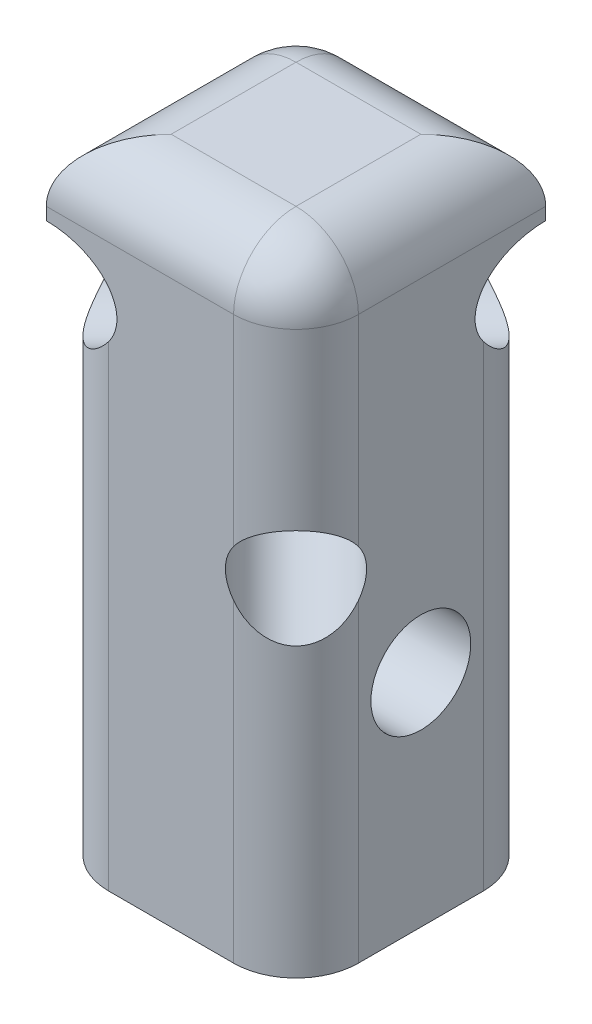
ISO-10303-21;
HEADER;
FILE_DESCRIPTION(('STEP AP214'),'2;1');
FILE_NAME('part.step','',(''),(''),'','','');
FILE_SCHEMA(('AUTOMOTIVE_DESIGN { 1 0 10303 214 1 1 1 1 }'));
ENDSEC;
DATA;
#1=APPLICATION_CONTEXT('core data for automotive mechanical design processes');
#2=APPLICATION_PROTOCOL_DEFINITION('international standard','automotive_design',2000,#1);
#3=PRODUCT_CONTEXT('',#1,'mechanical');
#4=PRODUCT('Part','Part','',(#3));
#5=PRODUCT_RELATED_PRODUCT_CATEGORY('part','',(#4));
#6=PRODUCT_DEFINITION_FORMATION('','',#4);
#7=PRODUCT_DEFINITION_CONTEXT('part definition',#1,'design');
#8=PRODUCT_DEFINITION('design','',#6,#7);
#9=PRODUCT_DEFINITION_SHAPE('','',#8);
#10=(LENGTH_UNIT() NAMED_UNIT(*) SI_UNIT(.MILLI.,.METRE.));
#11=(NAMED_UNIT(*) PLANE_ANGLE_UNIT() SI_UNIT($,.RADIAN.));
#12=(NAMED_UNIT(*) SI_UNIT($,.STERADIAN.) SOLID_ANGLE_UNIT());
#13=UNCERTAINTY_MEASURE_WITH_UNIT(LENGTH_MEASURE(1.E-05),#10,'distance_accuracy_value','');
#14=(GEOMETRIC_REPRESENTATION_CONTEXT(3) GLOBAL_UNCERTAINTY_ASSIGNED_CONTEXT((#13)) GLOBAL_UNIT_ASSIGNED_CONTEXT((#10,
#11,#12)) REPRESENTATION_CONTEXT('',''));
#15=CARTESIAN_POINT('',(0.,0.,0.));
#16=DIRECTION('',(0.,0.,1.));
#17=DIRECTION('',(1.,0.,0.));
#18=AXIS2_PLACEMENT_3D('',#15,#16,#17);
#19=CARTESIAN_POINT('',(3.,15.,3.));
#20=DIRECTION('',(-1.,0.,0.));
#21=DIRECTION('',(0.,0.,1.));
#22=AXIS2_PLACEMENT_3D('',#19,#20,#21);
#23=PLANE('',#22);
#24=CARTESIAN_POINT('',(3.,5.3,0.));
#25=DIRECTION('',(-1.,0.,0.));
#26=DIRECTION('',(0.,0.,1.));
#27=AXIS2_PLACEMENT_3D('',#24,#25,#26);
#28=CIRCLE('',#27,1.2);
#29=CARTESIAN_POINT('',(3.,5.3,1.2));
#30=VERTEX_POINT('',#29);
#31=EDGE_CURVE('E346',#30,#30,#28,.T.);
#32=ORIENTED_EDGE('',*,*,#31,.T.);
#33=EDGE_LOOP('',(#32));
#34=FACE_BOUND('',#33,.T.);
#35=DIRECTION('',(0.,-1.,0.));
#36=VECTOR('',#35,1.);
#37=CARTESIAN_POINT('',(3.,15.,-3.));
#38=LINE('',#37,#36);
#39=CARTESIAN_POINT('',(3.,13.5,-3.));
#40=VERTEX_POINT('',#39);
#41=CARTESIAN_POINT('',(3.,13.2,-3.));
#42=VERTEX_POINT('',#41);
#43=EDGE_CURVE('E172',#40,#42,#38,.T.);
#44=ORIENTED_EDGE('',*,*,#43,.F.);
#45=DIRECTION('',(0.,0.,-1.));
#46=VECTOR('',#45,1.);
#47=CARTESIAN_POINT('',(3.,13.5,3.));
#48=LINE('',#47,#46);
#49=CARTESIAN_POINT('',(3.,13.5,1.5));
#50=VERTEX_POINT('',#49);
#51=EDGE_CURVE('E52',#40,#50,#48,.F.);
#52=ORIENTED_EDGE('',*,*,#51,.T.);
#53=DIRECTION('',(0.,-1.,0.));
#54=VECTOR('',#53,1.);
#55=CARTESIAN_POINT('',(3.,15.,1.5));
#56=LINE('',#55,#54);
#57=CARTESIAN_POINT('',(3.,8.67124860801609,1.5));
#58=VERTEX_POINT('',#57);
#59=EDGE_CURVE('E221',#50,#58,#56,.T.);
#60=ORIENTED_EDGE('',*,*,#59,.T.);
#61=CARTESIAN_POINT('',(3.,8.11,3.));
#62=DIRECTION('',(-1.,0.,0.));
#63=DIRECTION('',(0.,0.,1.));
#64=AXIS2_PLACEMENT_3D('',#61,#62,#63);
#65=ELLIPSE('',#64,1.69705627484771,1.2);
#66=CARTESIAN_POINT('',(3.,7.54875139198391,1.5));
#67=VERTEX_POINT('',#66);
#68=EDGE_CURVE('E357',#58,#67,#65,.T.);
#69=ORIENTED_EDGE('',*,*,#68,.T.);
#70=DIRECTION('',(0.,-1.,0.));
#71=VECTOR('',#70,1.);
#72=CARTESIAN_POINT('',(3.,15.,1.5));
#73=LINE('',#72,#71);
#74=CARTESIAN_POINT('',(3.,0.,1.5));
#75=VERTEX_POINT('',#74);
#76=EDGE_CURVE('E218',#67,#75,#73,.T.);
#77=ORIENTED_EDGE('',*,*,#76,.T.);
#78=DIRECTION('',(0.,0.,-1.));
#79=VECTOR('',#78,1.);
#80=CARTESIAN_POINT('',(3.,0.,3.));
#81=LINE('',#80,#79);
#82=CARTESIAN_POINT('',(3.,0.,-1.5));
#83=VERTEX_POINT('',#82);
#84=EDGE_CURVE('E344',#75,#83,#81,.T.);
#85=ORIENTED_EDGE('',*,*,#84,.T.);
#86=DIRECTION('',(0.,-1.,0.));
#87=VECTOR('',#86,1.);
#88=CARTESIAN_POINT('',(3.,15.,-1.5));
#89=LINE('',#88,#87);
#90=CARTESIAN_POINT('',(3.,11.4387513919839,-1.5));
#91=VERTEX_POINT('',#90);
#92=EDGE_CURVE('E216',#83,#91,#89,.F.);
#93=ORIENTED_EDGE('',*,*,#92,.T.);
#94=CARTESIAN_POINT('',(3.,12.,-3.));
#95=DIRECTION('',(-1.,0.,0.));
#96=DIRECTION('',(0.,0.,1.));
#97=AXIS2_PLACEMENT_3D('',#94,#95,#96);
#98=ELLIPSE('',#97,1.69705627484771,1.2);
#99=EDGE_CURVE('E335',#91,#42,#98,.T.);
#100=ORIENTED_EDGE('',*,*,#99,.T.);
#101=EDGE_LOOP('',(#44,#52,#60,#69,#77,#85,#93,#100));
#102=FACE_BOUND('',#101,.T.);
#103=ADVANCED_FACE('F34',(#34,#102),#23,.F.);
#104=CARTESIAN_POINT('',(-3.,15.,-3.));
#105=DIRECTION('',(0.,0.,1.));
#106=DIRECTION('',(1.,0.,0.));
#107=AXIS2_PLACEMENT_3D('',#104,#105,#106);
#108=PLANE('',#107);
#109=CARTESIAN_POINT('',(3.,12.,-3.));
#110=DIRECTION('',(0.,0.,1.));
#111=DIRECTION('',(-1.,0.,0.));
#112=AXIS2_PLACEMENT_3D('',#109,#110,#111);
#113=ELLIPSE('',#112,1.69705627484771,1.2);
#114=CARTESIAN_POINT('',(1.5,11.4387513919839,-3.));
#115=VERTEX_POINT('',#114);
#116=EDGE_CURVE('E161',#42,#115,#113,.T.);
#117=ORIENTED_EDGE('',*,*,#116,.T.);
#118=DIRECTION('',(0.,-1.,0.));
#119=VECTOR('',#118,1.);
#120=CARTESIAN_POINT('',(1.5,15.,-3.));
#121=LINE('',#120,#119);
#122=CARTESIAN_POINT('',(1.5,0.,-3.));
#123=VERTEX_POINT('',#122);
#124=EDGE_CURVE('E213',#115,#123,#121,.T.);
#125=ORIENTED_EDGE('',*,*,#124,.T.);
#126=DIRECTION('',(-1.,0.,0.));
#127=VECTOR('',#126,1.);
#128=CARTESIAN_POINT('',(-3.,0.,-3.));
#129=LINE('',#128,#127);
#130=CARTESIAN_POINT('',(-1.5,0.,-3.));
#131=VERTEX_POINT('',#130);
#132=EDGE_CURVE('E341',#123,#131,#129,.T.);
#133=ORIENTED_EDGE('',*,*,#132,.T.);
#134=DIRECTION('',(0.,-1.,0.));
#135=VECTOR('',#134,1.);
#136=CARTESIAN_POINT('',(-1.5,15.,-3.));
#137=LINE('',#136,#135);
#138=CARTESIAN_POINT('',(-1.5,7.54875139198391,-3.));
#139=VERTEX_POINT('',#138);
#140=EDGE_CURVE('E207',#131,#139,#137,.F.);
#141=ORIENTED_EDGE('',*,*,#140,.T.);
#142=CARTESIAN_POINT('',(-3.,8.11,-3.));
#143=DIRECTION('',(0.,0.,1.));
#144=DIRECTION('',(1.,0.,0.));
#145=AXIS2_PLACEMENT_3D('',#142,#143,#144);
#146=ELLIPSE('',#145,1.69705627484771,1.2);
#147=CARTESIAN_POINT('',(-1.5,8.67124860801609,-3.));
#148=VERTEX_POINT('',#147);
#149=EDGE_CURVE('E352',#139,#148,#146,.T.);
#150=ORIENTED_EDGE('',*,*,#149,.T.);
#151=DIRECTION('',(0.,-1.,0.));
#152=VECTOR('',#151,1.);
#153=CARTESIAN_POINT('',(-1.5,15.,-3.));
#154=LINE('',#153,#152);
#155=CARTESIAN_POINT('',(-1.5,13.5,-3.));
#156=VERTEX_POINT('',#155);
#157=EDGE_CURVE('E209',#148,#156,#154,.F.);
#158=ORIENTED_EDGE('',*,*,#157,.T.);
#159=DIRECTION('',(-1.,0.,0.));
#160=VECTOR('',#159,1.);
#161=CARTESIAN_POINT('',(-3.,13.5,-3.));
#162=LINE('',#161,#160);
#163=EDGE_CURVE('E211',#156,#40,#162,.F.);
#164=ORIENTED_EDGE('',*,*,#163,.T.);
#165=ORIENTED_EDGE('',*,*,#43,.T.);
#166=EDGE_LOOP('',(#117,#125,#133,#141,#150,#158,#164,#165));
#167=FACE_BOUND('',#166,.T.);
#168=ADVANCED_FACE('F331',(#167),#108,.F.);
#169=CARTESIAN_POINT('',(-3.,15.,3.));
#170=DIRECTION('',(1.,0.,0.));
#171=DIRECTION('',(0.,0.,-1.));
#172=AXIS2_PLACEMENT_3D('',#169,#170,#171);
#173=PLANE('',#172);
#174=CARTESIAN_POINT('',(-3.,5.3,0.));
#175=DIRECTION('',(-1.,0.,0.));
#176=DIRECTION('',(0.,0.,1.));
#177=AXIS2_PLACEMENT_3D('',#174,#175,#176);
#178=CIRCLE('',#177,1.2);
#179=CARTESIAN_POINT('',(-3.,5.3,1.2));
#180=VERTEX_POINT('',#179);
#181=EDGE_CURVE('E349',#180,#180,#178,.T.);
#182=ORIENTED_EDGE('',*,*,#181,.F.);
#183=EDGE_LOOP('',(#182));
#184=FACE_BOUND('',#183,.T.);
#185=DIRECTION('',(0.,0.,1.));
#186=VECTOR('',#185,1.);
#187=CARTESIAN_POINT('',(-3.,0.,3.));
#188=LINE('',#187,#186);
#189=CARTESIAN_POINT('',(-3.,0.,-1.5));
#190=VERTEX_POINT('',#189);
#191=CARTESIAN_POINT('',(-3.,0.,1.5));
#192=VERTEX_POINT('',#191);
#193=EDGE_CURVE('E339',#190,#192,#188,.T.);
#194=ORIENTED_EDGE('',*,*,#193,.T.);
#195=DIRECTION('',(0.,-1.,0.));
#196=VECTOR('',#195,1.);
#197=CARTESIAN_POINT('',(-3.,15.,1.5));
#198=LINE('',#197,#196);
#199=CARTESIAN_POINT('',(-3.,11.4387513919839,1.5));
#200=VERTEX_POINT('',#199);
#201=EDGE_CURVE('E157',#192,#200,#198,.F.);
#202=ORIENTED_EDGE('',*,*,#201,.T.);
#203=CARTESIAN_POINT('',(-3.,12.,3.));
#204=DIRECTION('',(1.,0.,0.));
#205=DIRECTION('',(0.,0.,1.));
#206=AXIS2_PLACEMENT_3D('',#203,#204,#205);
#207=ELLIPSE('',#206,1.69705627484771,1.2);
#208=CARTESIAN_POINT('',(-3.,13.2,3.));
#209=VERTEX_POINT('',#208);
#210=EDGE_CURVE('E151',#200,#209,#207,.T.);
#211=ORIENTED_EDGE('',*,*,#210,.T.);
#212=DIRECTION('',(0.,-1.,0.));
#213=VECTOR('',#212,1.);
#214=CARTESIAN_POINT('',(-3.,15.,3.));
#215=LINE('',#214,#213);
#216=CARTESIAN_POINT('',(-3.,13.5,3.));
#217=VERTEX_POINT('',#216);
#218=EDGE_CURVE('E155',#217,#209,#215,.T.);
#219=ORIENTED_EDGE('',*,*,#218,.F.);
#220=DIRECTION('',(0.,0.,1.));
#221=VECTOR('',#220,1.);
#222=CARTESIAN_POINT('',(-3.,13.5,3.));
#223=LINE('',#222,#221);
#224=CARTESIAN_POINT('',(-3.,13.5,-1.5));
#225=VERTEX_POINT('',#224);
#226=EDGE_CURVE('E204',#217,#225,#223,.F.);
#227=ORIENTED_EDGE('',*,*,#226,.T.);
#228=DIRECTION('',(0.,-1.,0.));
#229=VECTOR('',#228,1.);
#230=CARTESIAN_POINT('',(-3.,15.,-1.5));
#231=LINE('',#230,#229);
#232=CARTESIAN_POINT('',(-3.,8.67124860801609,-1.5));
#233=VERTEX_POINT('',#232);
#234=EDGE_CURVE('E202',#225,#233,#231,.T.);
#235=ORIENTED_EDGE('',*,*,#234,.T.);
#236=CARTESIAN_POINT('',(-3.,8.11,-3.));
#237=DIRECTION('',(1.,0.,0.));
#238=DIRECTION('',(0.,0.,1.));
#239=AXIS2_PLACEMENT_3D('',#236,#237,#238);
#240=ELLIPSE('',#239,1.69705627484771,1.2);
#241=CARTESIAN_POINT('',(-3.,7.54875139198391,-1.5));
#242=VERTEX_POINT('',#241);
#243=EDGE_CURVE('E354',#233,#242,#240,.T.);
#244=ORIENTED_EDGE('',*,*,#243,.T.);
#245=DIRECTION('',(0.,-1.,0.));
#246=VECTOR('',#245,1.);
#247=CARTESIAN_POINT('',(-3.,15.,-1.5));
#248=LINE('',#247,#246);
#249=EDGE_CURVE('E199',#242,#190,#248,.T.);
#250=ORIENTED_EDGE('',*,*,#249,.T.);
#251=EDGE_LOOP('',(#194,#202,#211,#219,#227,#235,#244,#250));
#252=FACE_BOUND('',#251,.T.);
#253=ADVANCED_FACE('F154',(#184,#252),#173,.F.);
#254=CARTESIAN_POINT('',(-3.,15.,3.));
#255=DIRECTION('',(0.,0.,-1.));
#256=DIRECTION('',(-1.,0.,0.));
#257=AXIS2_PLACEMENT_3D('',#254,#255,#256);
#258=PLANE('',#257);
#259=DIRECTION('',(0.,-1.,0.));
#260=VECTOR('',#259,1.);
#261=CARTESIAN_POINT('',(1.5,15.,3.));
#262=LINE('',#261,#260);
#263=CARTESIAN_POINT('',(1.5,8.67124860801609,3.));
#264=VERTEX_POINT('',#263);
#265=CARTESIAN_POINT('',(1.5,13.5,3.));
#266=VERTEX_POINT('',#265);
#267=EDGE_CURVE('E196',#264,#266,#262,.F.);
#268=ORIENTED_EDGE('',*,*,#267,.T.);
#269=DIRECTION('',(1.,0.,0.));
#270=VECTOR('',#269,1.);
#271=CARTESIAN_POINT('',(-3.,13.5,3.));
#272=LINE('',#271,#270);
#273=EDGE_CURVE('E171',#266,#217,#272,.F.);
#274=ORIENTED_EDGE('',*,*,#273,.T.);
#275=ORIENTED_EDGE('',*,*,#218,.T.);
#276=CARTESIAN_POINT('',(-3.,12.,3.));
#277=DIRECTION('',(0.,0.,-1.));
#278=DIRECTION('',(-1.,0.,0.));
#279=AXIS2_PLACEMENT_3D('',#276,#277,#278);
#280=ELLIPSE('',#279,1.69705627484771,1.2);
#281=CARTESIAN_POINT('',(-1.5,11.4387513919839,3.));
#282=VERTEX_POINT('',#281);
#283=EDGE_CURVE('E168',#209,#282,#280,.T.);
#284=ORIENTED_EDGE('',*,*,#283,.T.);
#285=DIRECTION('',(0.,-1.,0.));
#286=VECTOR('',#285,1.);
#287=CARTESIAN_POINT('',(-1.5,15.,3.));
#288=LINE('',#287,#286);
#289=CARTESIAN_POINT('',(-1.5,0.,3.));
#290=VERTEX_POINT('',#289);
#291=EDGE_CURVE('E194',#282,#290,#288,.T.);
#292=ORIENTED_EDGE('',*,*,#291,.T.);
#293=DIRECTION('',(1.,0.,0.));
#294=VECTOR('',#293,1.);
#295=CARTESIAN_POINT('',(-3.,0.,3.));
#296=LINE('',#295,#294);
#297=CARTESIAN_POINT('',(1.5,0.,3.));
#298=VERTEX_POINT('',#297);
#299=EDGE_CURVE('E173',#290,#298,#296,.T.);
#300=ORIENTED_EDGE('',*,*,#299,.T.);
#301=DIRECTION('',(0.,-1.,0.));
#302=VECTOR('',#301,1.);
#303=CARTESIAN_POINT('',(1.5,15.,3.));
#304=LINE('',#303,#302);
#305=CARTESIAN_POINT('',(1.5,7.54875139198391,3.));
#306=VERTEX_POINT('',#305);
#307=EDGE_CURVE('E192',#298,#306,#304,.F.);
#308=ORIENTED_EDGE('',*,*,#307,.T.);
#309=CARTESIAN_POINT('',(3.,8.11,3.));
#310=DIRECTION('',(0.,0.,-1.));
#311=DIRECTION('',(1.,0.,0.));
#312=AXIS2_PLACEMENT_3D('',#309,#310,#311);
#313=ELLIPSE('',#312,1.69705627484771,1.2);
#314=EDGE_CURVE('E178',#306,#264,#313,.T.);
#315=ORIENTED_EDGE('',*,*,#314,.T.);
#316=EDGE_LOOP('',(#268,#274,#275,#284,#292,#300,#308,#315));
#317=FACE_BOUND('',#316,.T.);
#318=ADVANCED_FACE('F166',(#317),#258,.F.);
#319=CARTESIAN_POINT('',(0.,15.,0.));
#320=DIRECTION('',(0.,-1.,0.));
#321=DIRECTION('',(0.,0.,-1.));
#322=AXIS2_PLACEMENT_3D('',#319,#320,#321);
#323=PLANE('',#322);
#324=DIRECTION('',(0.,0.,1.));
#325=VECTOR('',#324,1.);
#326=CARTESIAN_POINT('',(-1.5,15.,0.));
#327=LINE('',#326,#325);
#328=CARTESIAN_POINT('',(-1.5,15.,-1.5));
#329=VERTEX_POINT('',#328);
#330=CARTESIAN_POINT('',(-1.5,15.,1.5));
#331=VERTEX_POINT('',#330);
#332=EDGE_CURVE('E187',#329,#331,#327,.T.);
#333=ORIENTED_EDGE('',*,*,#332,.T.);
#334=DIRECTION('',(1.,0.,0.));
#335=VECTOR('',#334,1.);
#336=CARTESIAN_POINT('',(0.,15.,1.5));
#337=LINE('',#336,#335);
#338=CARTESIAN_POINT('',(1.5,15.,1.5));
#339=VERTEX_POINT('',#338);
#340=EDGE_CURVE('E189',#331,#339,#337,.T.);
#341=ORIENTED_EDGE('',*,*,#340,.T.);
#342=DIRECTION('',(0.,0.,-1.));
#343=VECTOR('',#342,1.);
#344=CARTESIAN_POINT('',(1.5,15.,0.));
#345=LINE('',#344,#343);
#346=CARTESIAN_POINT('',(1.5,15.,-1.5));
#347=VERTEX_POINT('',#346);
#348=EDGE_CURVE('E177',#339,#347,#345,.T.);
#349=ORIENTED_EDGE('',*,*,#348,.T.);
#350=DIRECTION('',(-1.,0.,0.));
#351=VECTOR('',#350,1.);
#352=CARTESIAN_POINT('',(0.,15.,-1.5));
#353=LINE('',#352,#351);
#354=EDGE_CURVE('E180',#347,#329,#353,.T.);
#355=ORIENTED_EDGE('',*,*,#354,.T.);
#356=EDGE_LOOP('',(#333,#341,#349,#355));
#357=FACE_BOUND('',#356,.T.);
#358=ADVANCED_FACE('F321',(#357),#323,.F.);
#359=CARTESIAN_POINT('',(0.,0.,0.));
#360=DIRECTION('',(0.,-1.,0.));
#361=DIRECTION('',(0.,0.,-1.));
#362=AXIS2_PLACEMENT_3D('',#359,#360,#361);
#363=PLANE('',#362);
#364=ORIENTED_EDGE('',*,*,#299,.F.);
#365=CARTESIAN_POINT('',(-1.5,0.,1.5));
#366=DIRECTION('',(0.,-1.,0.));
#367=DIRECTION('',(0.,0.,-1.));
#368=AXIS2_PLACEMENT_3D('',#365,#366,#367);
#369=CIRCLE('',#368,1.5);
#370=EDGE_CURVE('E281',#290,#192,#369,.T.);
#371=ORIENTED_EDGE('',*,*,#370,.T.);
#372=ORIENTED_EDGE('',*,*,#193,.F.);
#373=CARTESIAN_POINT('',(-1.5,0.,-1.5));
#374=DIRECTION('',(0.,-1.,0.));
#375=DIRECTION('',(0.,0.,-1.));
#376=AXIS2_PLACEMENT_3D('',#373,#374,#375);
#377=CIRCLE('',#376,1.5);
#378=EDGE_CURVE('E365',#190,#131,#377,.T.);
#379=ORIENTED_EDGE('',*,*,#378,.T.);
#380=ORIENTED_EDGE('',*,*,#132,.F.);
#381=CARTESIAN_POINT('',(1.5,0.,-1.5));
#382=DIRECTION('',(0.,-1.,0.));
#383=DIRECTION('',(0.,0.,-1.));
#384=AXIS2_PLACEMENT_3D('',#381,#382,#383);
#385=CIRCLE('',#384,1.5);
#386=EDGE_CURVE('E60',#123,#83,#385,.T.);
#387=ORIENTED_EDGE('',*,*,#386,.T.);
#388=ORIENTED_EDGE('',*,*,#84,.F.);
#389=CARTESIAN_POINT('',(1.5,0.,1.5));
#390=DIRECTION('',(0.,-1.,0.));
#391=DIRECTION('',(0.,0.,-1.));
#392=AXIS2_PLACEMENT_3D('',#389,#390,#391);
#393=CIRCLE('',#392,1.5);
#394=EDGE_CURVE('E364',#75,#298,#393,.T.);
#395=ORIENTED_EDGE('',*,*,#394,.T.);
#396=EDGE_LOOP('',(#364,#371,#372,#379,#380,#387,#388,#395));
#397=FACE_BOUND('',#396,.T.);
#398=ADVANCED_FACE('F501',(#397),#363,.T.);
#399=CARTESIAN_POINT('',(12.,5.3,0.));
#400=DIRECTION('',(-1.,0.,0.));
#401=DIRECTION('',(0.,0.,1.));
#402=AXIS2_PLACEMENT_3D('',#399,#400,#401);
#403=CYLINDRICAL_SURFACE('',#402,1.2);
#404=ORIENTED_EDGE('',*,*,#181,.T.);
#405=EDGE_LOOP('',(#404));
#406=FACE_BOUND('',#405,.T.);
#407=ORIENTED_EDGE('',*,*,#31,.F.);
#408=EDGE_LOOP('',(#407));
#409=FACE_BOUND('',#408,.T.);
#410=ADVANCED_FACE('F243',(#406,#409),#403,.F.);
#411=CARTESIAN_POINT('',(-7.60660171779821,8.11,-7.60660171779821));
#412=DIRECTION('',(0.707106781186547,0.,0.707106781186547));
#413=DIRECTION('',(0.707106781186548,0.,-0.707106781186548));
#414=AXIS2_PLACEMENT_3D('',#411,#412,#413);
#415=CYLINDRICAL_SURFACE('',#414,1.2);
#416=ORIENTED_EDGE('',*,*,#68,.F.);
#417=CARTESIAN_POINT('',(3.,8.67124860801609,1.5));
#418=CARTESIAN_POINT('',(3.0000074515174,8.70375380242947,1.52435238785926));
#419=CARTESIAN_POINT('',(2.99940758255962,8.73526029424968,1.55001612930455));
#420=CARTESIAN_POINT('',(2.99665870005445,8.79627924182065,1.60356389924524));
#421=CARTESIAN_POINT('',(2.99450905295214,8.82579087666832,1.63144883162327));
#422=CARTESIAN_POINT('',(2.98830279467517,8.88300672549363,1.68922788372254));
#423=CARTESIAN_POINT('',(2.98423226003079,8.91069603264969,1.7191352845192));
#424=CARTESIAN_POINT('',(2.97388176448269,8.96392146789738,1.78042594318512));
#425=CARTESIAN_POINT('',(2.96760233514802,8.98945811219471,1.8118088444034));
#426=CARTESIAN_POINT('',(2.94748647509328,9.0546304293811,1.89723339880849));
#427=CARTESIAN_POINT('',(2.93140653768891,9.09222926091189,1.95234954790152));
#428=CARTESIAN_POINT('',(2.89114681668331,9.15976852624083,2.06411128967546));
#429=CARTESIAN_POINT('',(2.86699355513648,9.18973347773387,2.12075132312417));
#430=CARTESIAN_POINT('',(2.81480652308525,9.23619842112322,2.22389299870696));
#431=CARTESIAN_POINT('',(2.78817044643175,9.25413190851677,2.27045070783101));
#432=CARTESIAN_POINT('',(2.72884922948924,9.28291191855803,2.36191320866964));
#433=CARTESIAN_POINT('',(2.6961657031936,9.29376032863869,2.4068184375871));
#434=CARTESIAN_POINT('',(2.62515589219098,9.30771118030529,2.49356733388494));
#435=CARTESIAN_POINT('',(2.58680845876118,9.31078377190172,2.53539860642305));
#436=CARTESIAN_POINT('',(2.5057099716425,9.30887517296329,2.6143378003281));
#437=CARTESIAN_POINT('',(2.46295915031423,9.30389440718919,2.65144597069576));
#438=CARTESIAN_POINT('',(2.37741363170884,9.28679973157696,2.7177395323759));
#439=CARTESIAN_POINT('',(2.33479505583408,9.27516021095855,2.74727894795471));
#440=CARTESIAN_POINT('',(2.24833654501656,9.24576378168324,2.80099386614687));
#441=CARTESIAN_POINT('',(2.20449645395944,9.2280060877735,2.8251686795713));
#442=CARTESIAN_POINT('',(2.11297789456667,9.18537261676178,2.8700639875279));
#443=CARTESIAN_POINT('',(2.06529288613751,9.16001677012882,2.89031001616575));
#444=CARTESIAN_POINT('',(1.97100683921805,9.10388285763672,2.92501996243675));
#445=CARTESIAN_POINT('',(1.92440698503992,9.0730991555595,2.93947781816251));
#446=CARTESIAN_POINT('',(1.82405881020048,9.00013404036022,2.96567100694087));
#447=CARTESIAN_POINT('',(1.77077543766531,8.95690706391466,2.97626097649177));
#448=CARTESIAN_POINT('',(1.66879535569749,8.8644922428498,2.99136055131722));
#449=CARTESIAN_POINT('',(1.62009422071846,8.81531025683675,2.9958760805606));
#450=CARTESIAN_POINT('',(1.56161074225773,8.74841158921216,2.99879126532978));
#451=CARTESIAN_POINT('',(1.54886822458433,8.73330171205484,2.99925565378302));
#452=CARTESIAN_POINT('',(1.52397915380118,8.70262496921264,2.99985975991714));
#453=CARTESIAN_POINT('',(1.51183185638863,8.68705871529329,2.99999989376271));
#454=CARTESIAN_POINT('',(1.49999999999933,8.67124860801673,3.00000000000125));
#455=B_SPLINE_CURVE_WITH_KNOTS('',3,(#417,#418,#419,#420,#421,#422,#423,#424,#425,#426,#427,
#428,#429,#430,#431,#432,#433,#434,#435,#436,#437,#438,#439,#440,#441,#442,#443,#444,#445,#446,
#447,#448,#449,#450,#451,#452,#453,#454),.UNSPECIFIED.,.F.,.F.,(4,2,2,2,2,2,2,2,2,2,2,2,2,2,2,2,
2,2,4),(0.,0.121789996948118,0.24362981033953,0.366366667496226,0.489074008291935,
0.694115816831217,0.898490546976693,1.06745031583966,1.23636505619535,1.4059272534096,
1.57548050764337,1.73423763896801,1.893015153984,2.06541826614772,2.23800146533319,
2.44555670313568,2.65290938000605,2.71221089742098,2.77143626196664),.UNSPECIFIED.);
#456=EDGE_CURVE('E257',#58,#264,#455,.T.);
#457=ORIENTED_EDGE('',*,*,#456,.T.);
#458=ORIENTED_EDGE('',*,*,#314,.F.);
#459=CARTESIAN_POINT('',(1.5,7.54875139198391,3.));
#460=CARTESIAN_POINT('',(1.52435238785926,7.51624619757053,3.0000074515174));
#461=CARTESIAN_POINT('',(1.55001612930455,7.48473970575031,2.99940758255962));
#462=CARTESIAN_POINT('',(1.60356389924524,7.42372075817935,2.99665870005444));
#463=CARTESIAN_POINT('',(1.63144883162327,7.39420912333168,2.99450905295214));
#464=CARTESIAN_POINT('',(1.68922788372254,7.33699327450636,2.98830279467517));
#465=CARTESIAN_POINT('',(1.71913528451921,7.30930396735031,2.98423226003079));
#466=CARTESIAN_POINT('',(1.78042594318513,7.25607853210262,2.97388176448269));
#467=CARTESIAN_POINT('',(1.8118088444034,7.23054188780529,2.96760233514802));
#468=CARTESIAN_POINT('',(1.89723339880849,7.1653695706189,2.94748647509328));
#469=CARTESIAN_POINT('',(1.95234954790152,7.12777073908811,2.93140653768891));
#470=CARTESIAN_POINT('',(2.06411128967546,7.06023147375917,2.89114681668331));
#471=CARTESIAN_POINT('',(2.12075132312417,7.03026652226614,2.86699355513648));
#472=CARTESIAN_POINT('',(2.22389299870696,6.98380157887678,2.81480652308525));
#473=CARTESIAN_POINT('',(2.27045070783101,6.96586809148323,2.78817044643175));
#474=CARTESIAN_POINT('',(2.36191320866964,6.93708808144198,2.72884922948924));
#475=CARTESIAN_POINT('',(2.4068184375871,6.92623967136131,2.69616570319359));
#476=CARTESIAN_POINT('',(2.49356733388494,6.91228881969471,2.62515589219097));
#477=CARTESIAN_POINT('',(2.53539860642305,6.90921622809828,2.58680845876118));
#478=CARTESIAN_POINT('',(2.61433780032811,6.91112482703671,2.5057099716425));
#479=CARTESIAN_POINT('',(2.65144597069576,6.91610559281081,2.46295915031423));
#480=CARTESIAN_POINT('',(2.7177395323759,6.93320026842304,2.37741363170884));
#481=CARTESIAN_POINT('',(2.74727894795471,6.94483978904145,2.33479505583408));
#482=CARTESIAN_POINT('',(2.80099386614687,6.97423621831677,2.24833654501656));
#483=CARTESIAN_POINT('',(2.8251686795713,6.99199391222651,2.20449645395944));
#484=CARTESIAN_POINT('',(2.8700639875279,7.03462738323822,2.11297789456667));
#485=CARTESIAN_POINT('',(2.89031001616575,7.05998322987118,2.06529288613751));
#486=CARTESIAN_POINT('',(2.92501996243675,7.11611714236328,1.97100683921804));
#487=CARTESIAN_POINT('',(2.93947781816251,7.1469008444405,1.92440698503992));
#488=CARTESIAN_POINT('',(2.96567100694087,7.21986595963979,1.82405881020048));
#489=CARTESIAN_POINT('',(2.97626097649177,7.26309293608534,1.77077543766531));
#490=CARTESIAN_POINT('',(2.99136055131722,7.35550775715021,1.66879535569749));
#491=CARTESIAN_POINT('',(2.9958760805606,7.40468974316325,1.62009422071846));
#492=CARTESIAN_POINT('',(2.99879126532978,7.47158841078784,1.56161074225773));
#493=CARTESIAN_POINT('',(2.99925565378302,7.48669828794516,1.54886822458433));
#494=CARTESIAN_POINT('',(2.99985975991714,7.51737503078736,1.52397915380118));
#495=CARTESIAN_POINT('',(2.99999989376271,7.53294128470671,1.51183185638863));
#496=CARTESIAN_POINT('',(3.00000000000125,7.54875139198327,1.49999999999933));
#497=B_SPLINE_CURVE_WITH_KNOTS('',3,(#459,#460,#461,#462,#463,#464,#465,#466,#467,#468,#469,
#470,#471,#472,#473,#474,#475,#476,#477,#478,#479,#480,#481,#482,#483,#484,#485,#486,#487,#488,
#489,#490,#491,#492,#493,#494,#495,#496),.UNSPECIFIED.,.F.,.F.,(4,2,2,2,2,2,2,2,2,2,2,2,2,2,2,2,
2,2,4),(0.,0.121789996948119,0.243629810339532,0.366366667496227,0.489074008291936,
0.694115816831219,0.898490546976695,1.06745031583966,1.23636505619535,1.4059272534096,
1.57548050764337,1.73423763896801,1.893015153984,2.06541826614772,2.23800146533319,
2.44555670313568,2.65290938000605,2.71221089742098,2.77143626196664),.UNSPECIFIED.);
#498=EDGE_CURVE('E251',#306,#67,#497,.T.);
#499=ORIENTED_EDGE('',*,*,#498,.T.);
#500=EDGE_LOOP('',(#416,#457,#458,#499));
#501=FACE_BOUND('',#500,.T.);
#502=ORIENTED_EDGE('',*,*,#243,.F.);
#503=CARTESIAN_POINT('',(-3.,8.67124860801609,-1.5));
#504=CARTESIAN_POINT('',(-3.0000074515174,8.70375380242948,-1.52435238785926));
#505=CARTESIAN_POINT('',(-2.99940758255962,8.73526029424969,-1.55001612930455));
#506=CARTESIAN_POINT('',(-2.99665870005444,8.79627924182065,-1.60356389924525));
#507=CARTESIAN_POINT('',(-2.99450905295214,8.82579087666832,-1.63144883162327));
#508=CARTESIAN_POINT('',(-2.98830279467517,8.88300672549364,-1.68922788372254));
#509=CARTESIAN_POINT('',(-2.98423226003079,8.91069603264969,-1.71913528451921));
#510=CARTESIAN_POINT('',(-2.97388176448269,8.96392146789738,-1.78042594318513));
#511=CARTESIAN_POINT('',(-2.96760233514802,8.98945811219471,-1.8118088444034));
#512=CARTESIAN_POINT('',(-2.94748647509328,9.0546304293811,-1.89723339880849));
#513=CARTESIAN_POINT('',(-2.93140653768891,9.09222926091189,-1.95234954790152));
#514=CARTESIAN_POINT('',(-2.89114681668331,9.15976852624083,-2.06411128967546));
#515=CARTESIAN_POINT('',(-2.86699355513648,9.18973347773387,-2.12075132312417));
#516=CARTESIAN_POINT('',(-2.81480652308525,9.23619842112322,-2.22389299870696));
#517=CARTESIAN_POINT('',(-2.78817044643175,9.25413190851677,-2.27045070783101));
#518=CARTESIAN_POINT('',(-2.72884922948924,9.28291191855803,-2.36191320866964));
#519=CARTESIAN_POINT('',(-2.69616570319359,9.29376032863869,-2.4068184375871));
#520=CARTESIAN_POINT('',(-2.62515589219097,9.30771118030529,-2.49356733388494));
#521=CARTESIAN_POINT('',(-2.58680845876118,9.31078377190172,-2.53539860642305));
#522=CARTESIAN_POINT('',(-2.5057099716425,9.30887517296329,-2.61433780032811));
#523=CARTESIAN_POINT('',(-2.46295915031423,9.30389440718919,-2.65144597069576));
#524=CARTESIAN_POINT('',(-2.37741363170884,9.28679973157696,-2.7177395323759));
#525=CARTESIAN_POINT('',(-2.33479505583408,9.27516021095855,-2.74727894795471));
#526=CARTESIAN_POINT('',(-2.24833654501656,9.24576378168323,-2.80099386614687));
#527=CARTESIAN_POINT('',(-2.20449645395944,9.22800608777349,-2.8251686795713));
#528=CARTESIAN_POINT('',(-2.11297789456667,9.18537261676178,-2.8700639875279));
#529=CARTESIAN_POINT('',(-2.06529288613751,9.16001677012882,-2.89031001616575));
#530=CARTESIAN_POINT('',(-1.97100683921804,9.10388285763672,-2.92501996243675));
#531=CARTESIAN_POINT('',(-1.92440698503992,9.0730991555595,-2.93947781816251));
#532=CARTESIAN_POINT('',(-1.82405881020048,9.00013404036022,-2.96567100694087));
#533=CARTESIAN_POINT('',(-1.77077543766531,8.95690706391466,-2.97626097649177));
#534=CARTESIAN_POINT('',(-1.6687953556975,8.8644922428498,-2.99136055131722));
#535=CARTESIAN_POINT('',(-1.62009422071846,8.81531025683675,-2.9958760805606));
#536=CARTESIAN_POINT('',(-1.56161074225774,8.74841158921216,-2.99879126532978));
#537=CARTESIAN_POINT('',(-1.54886822458434,8.73330171205484,-2.99925565378302));
#538=CARTESIAN_POINT('',(-1.52397915380118,8.70262496921264,-2.99985975991714));
#539=CARTESIAN_POINT('',(-1.51183185638863,8.68705871529329,-2.99999989376271));
#540=CARTESIAN_POINT('',(-1.49999999999933,8.67124860801673,-3.00000000000125));
#541=B_SPLINE_CURVE_WITH_KNOTS('',3,(#503,#504,#505,#506,#507,#508,#509,#510,#511,#512,#513,
#514,#515,#516,#517,#518,#519,#520,#521,#522,#523,#524,#525,#526,#527,#528,#529,#530,#531,#532,
#533,#534,#535,#536,#537,#538,#539,#540),.UNSPECIFIED.,.F.,.F.,(4,2,2,2,2,2,2,2,2,2,2,2,2,2,2,2,
2,2,4),(0.,0.121789996948118,0.243629810339531,0.366366667496227,0.489074008291936,
0.69411581683122,0.898490546976696,1.06745031583966,1.23636505619535,1.4059272534096,
1.57548050764337,1.73423763896801,1.893015153984,2.06541826614772,2.23800146533319,
2.44555670313568,2.65290938000605,2.71221089742097,2.77143626196664),.UNSPECIFIED.);
#542=EDGE_CURVE('E231',#233,#148,#541,.T.);
#543=ORIENTED_EDGE('',*,*,#542,.T.);
#544=ORIENTED_EDGE('',*,*,#149,.F.);
#545=CARTESIAN_POINT('',(-1.5,7.54875139198391,-3.));
#546=CARTESIAN_POINT('',(-1.52435238785926,7.51624619757053,-3.0000074515174));
#547=CARTESIAN_POINT('',(-1.55001612930455,7.48473970575031,-2.99940758255962));
#548=CARTESIAN_POINT('',(-1.60356389924525,7.42372075817935,-2.99665870005445));
#549=CARTESIAN_POINT('',(-1.63144883162327,7.39420912333168,-2.99450905295214));
#550=CARTESIAN_POINT('',(-1.68922788372254,7.33699327450636,-2.98830279467517));
#551=CARTESIAN_POINT('',(-1.71913528451921,7.30930396735031,-2.98423226003079));
#552=CARTESIAN_POINT('',(-1.78042594318513,7.25607853210262,-2.97388176448269));
#553=CARTESIAN_POINT('',(-1.8118088444034,7.23054188780529,-2.96760233514802));
#554=CARTESIAN_POINT('',(-1.89723339880849,7.1653695706189,-2.94748647509328));
#555=CARTESIAN_POINT('',(-1.95234954790152,7.12777073908811,-2.93140653768891));
#556=CARTESIAN_POINT('',(-2.06411128967546,7.06023147375917,-2.89114681668331));
#557=CARTESIAN_POINT('',(-2.12075132312417,7.03026652226613,-2.86699355513648));
#558=CARTESIAN_POINT('',(-2.22389299870696,6.98380157887678,-2.81480652308525));
#559=CARTESIAN_POINT('',(-2.27045070783101,6.96586809148323,-2.78817044643175));
#560=CARTESIAN_POINT('',(-2.36191320866964,6.93708808144198,-2.72884922948924));
#561=CARTESIAN_POINT('',(-2.4068184375871,6.92623967136131,-2.69616570319359));
#562=CARTESIAN_POINT('',(-2.49356733388494,6.91228881969471,-2.62515589219097));
#563=CARTESIAN_POINT('',(-2.53539860642305,6.90921622809828,-2.58680845876118));
#564=CARTESIAN_POINT('',(-2.61433780032811,6.91112482703671,-2.5057099716425));
#565=CARTESIAN_POINT('',(-2.65144597069576,6.91610559281081,-2.46295915031423));
#566=CARTESIAN_POINT('',(-2.7177395323759,6.93320026842304,-2.37741363170884));
#567=CARTESIAN_POINT('',(-2.74727894795471,6.94483978904145,-2.33479505583408));
#568=CARTESIAN_POINT('',(-2.80099386614687,6.97423621831676,-2.24833654501656));
#569=CARTESIAN_POINT('',(-2.8251686795713,6.99199391222651,-2.20449645395944));
#570=CARTESIAN_POINT('',(-2.8700639875279,7.03462738323822,-2.11297789456667));
#571=CARTESIAN_POINT('',(-2.89031001616575,7.05998322987118,-2.06529288613751));
#572=CARTESIAN_POINT('',(-2.92501996243675,7.11611714236328,-1.97100683921805));
#573=CARTESIAN_POINT('',(-2.93947781816251,7.1469008444405,-1.92440698503992));
#574=CARTESIAN_POINT('',(-2.96567100694087,7.21986595963979,-1.82405881020048));
#575=CARTESIAN_POINT('',(-2.97626097649177,7.26309293608534,-1.77077543766531));
#576=CARTESIAN_POINT('',(-2.99136055131722,7.35550775715021,-1.6687953556975));
#577=CARTESIAN_POINT('',(-2.9958760805606,7.40468974316325,-1.62009422071846));
#578=CARTESIAN_POINT('',(-2.99879126532978,7.47158841078784,-1.56161074225774));
#579=CARTESIAN_POINT('',(-2.99925565378302,7.48669828794516,-1.54886822458434));
#580=CARTESIAN_POINT('',(-2.99985975991714,7.51737503078736,-1.52397915380118));
#581=CARTESIAN_POINT('',(-2.99999989376271,7.53294128470671,-1.51183185638863));
#582=CARTESIAN_POINT('',(-3.00000000000125,7.54875139198327,-1.49999999999933));
#583=B_SPLINE_CURVE_WITH_KNOTS('',3,(#545,#546,#547,#548,#549,#550,#551,#552,#553,#554,#555,
#556,#557,#558,#559,#560,#561,#562,#563,#564,#565,#566,#567,#568,#569,#570,#571,#572,#573,#574,
#575,#576,#577,#578,#579,#580,#581,#582),.UNSPECIFIED.,.F.,.F.,(4,2,2,2,2,2,2,2,2,2,2,2,2,2,2,2,
2,2,4),(0.,0.121789996948121,0.243629810339533,0.366366667496228,0.489074008291938,
0.69411581683122,0.898490546976696,1.06745031583966,1.23636505619535,1.4059272534096,
1.57548050764337,1.73423763896801,1.893015153984,2.06541826614772,2.23800146533319,
2.44555670313568,2.65290938000605,2.71221089742097,2.77143626196664),.UNSPECIFIED.);
#584=EDGE_CURVE('E224',#139,#242,#583,.T.);
#585=ORIENTED_EDGE('',*,*,#584,.T.);
#586=EDGE_LOOP('',(#502,#543,#544,#585));
#587=FACE_BOUND('',#586,.T.);
#588=ADVANCED_FACE('F238',(#501,#587),#415,.F.);
#589=CARTESIAN_POINT('',(7.60660171779821,12.,-7.60660171779821));
#590=DIRECTION('',(-0.707106781186547,0.,0.707106781186547));
#591=DIRECTION('',(0.707106781186548,0.,0.707106781186548));
#592=AXIS2_PLACEMENT_3D('',#589,#590,#591);
#593=CYLINDRICAL_SURFACE('',#592,1.2);
#594=ORIENTED_EDGE('',*,*,#210,.F.);
#595=CARTESIAN_POINT('',(-3.,11.4387513919839,1.5));
#596=CARTESIAN_POINT('',(-3.0000074515174,11.4062461975705,1.52435238785926));
#597=CARTESIAN_POINT('',(-2.99940758255962,11.3747397057503,1.55001612930455));
#598=CARTESIAN_POINT('',(-2.99665870005445,11.3137207581794,1.60356389924524));
#599=CARTESIAN_POINT('',(-2.99450905295214,11.2842091233317,1.63144883162327));
#600=CARTESIAN_POINT('',(-2.98830279467517,11.2269932745064,1.68922788372254));
#601=CARTESIAN_POINT('',(-2.98423226003079,11.1993039673503,1.7191352845192));
#602=CARTESIAN_POINT('',(-2.97388176448269,11.1460785321026,1.78042594318512));
#603=CARTESIAN_POINT('',(-2.96760233514802,11.1205418878053,1.8118088444034));
#604=CARTESIAN_POINT('',(-2.94748647509328,11.0553695706189,1.89723339880849));
#605=CARTESIAN_POINT('',(-2.93140653768891,11.0177707390881,1.95234954790152));
#606=CARTESIAN_POINT('',(-2.89114681668331,10.9502314737592,2.06411128967546));
#607=CARTESIAN_POINT('',(-2.86699355513648,10.9202665222661,2.12075132312417));
#608=CARTESIAN_POINT('',(-2.81480652308525,10.8738015788768,2.22389299870696));
#609=CARTESIAN_POINT('',(-2.78817044643175,10.8558680914832,2.27045070783101));
#610=CARTESIAN_POINT('',(-2.72884922948924,10.827088081442,2.36191320866964));
#611=CARTESIAN_POINT('',(-2.6961657031936,10.8162396713613,2.4068184375871));
#612=CARTESIAN_POINT('',(-2.62515589219098,10.8022888196947,2.49356733388494));
#613=CARTESIAN_POINT('',(-2.58680845876118,10.7992162280983,2.53539860642305));
#614=CARTESIAN_POINT('',(-2.5057099716425,10.8011248270367,2.6143378003281));
#615=CARTESIAN_POINT('',(-2.46295915031423,10.8061055928108,2.65144597069576));
#616=CARTESIAN_POINT('',(-2.37741363170884,10.823200268423,2.7177395323759));
#617=CARTESIAN_POINT('',(-2.33479505583408,10.8348397890414,2.74727894795471));
#618=CARTESIAN_POINT('',(-2.24833654501656,10.8642362183168,2.80099386614687));
#619=CARTESIAN_POINT('',(-2.20449645395944,10.8819939122265,2.8251686795713));
#620=CARTESIAN_POINT('',(-2.11297789456667,10.9246273832382,2.8700639875279));
#621=CARTESIAN_POINT('',(-2.06529288613751,10.9499832298712,2.89031001616575));
#622=CARTESIAN_POINT('',(-1.97100683921804,11.0061171423633,2.92501996243675));
#623=CARTESIAN_POINT('',(-1.92440698503992,11.0369008444405,2.93947781816251));
#624=CARTESIAN_POINT('',(-1.82405881020048,11.1098659596398,2.96567100694087));
#625=CARTESIAN_POINT('',(-1.77077543766531,11.1530929360853,2.97626097649177));
#626=CARTESIAN_POINT('',(-1.6687953556975,11.2455077571502,2.99136055131722));
#627=CARTESIAN_POINT('',(-1.62009422071846,11.2946897431633,2.9958760805606));
#628=CARTESIAN_POINT('',(-1.56161074225774,11.3615884107878,2.99879126532978));
#629=CARTESIAN_POINT('',(-1.54886822458434,11.3766982879452,2.99925565378302));
#630=CARTESIAN_POINT('',(-1.52397915380118,11.4073750307874,2.99985975991714));
#631=CARTESIAN_POINT('',(-1.51183185638863,11.4229412847067,2.99999989376271));
#632=CARTESIAN_POINT('',(-1.49999999999933,11.4387513919833,3.00000000000125));
#633=B_SPLINE_CURVE_WITH_KNOTS('',3,(#595,#596,#597,#598,#599,#600,#601,#602,#603,#604,#605,
#606,#607,#608,#609,#610,#611,#612,#613,#614,#615,#616,#617,#618,#619,#620,#621,#622,#623,#624,
#625,#626,#627,#628,#629,#630,#631,#632),.UNSPECIFIED.,.F.,.F.,(4,2,2,2,2,2,2,2,2,2,2,2,2,2,2,2,
2,2,4),(0.,0.121789996948118,0.24362981033953,0.366366667496226,0.489074008291935,
0.694115816831218,0.898490546976694,1.06745031583966,1.23636505619535,1.4059272534096,
1.57548050764337,1.73423763896801,1.893015153984,2.06541826614772,2.23800146533319,
2.44555670313568,2.65290938000605,2.71221089742097,2.77143626196664),.UNSPECIFIED.);
#634=EDGE_CURVE('E11',#200,#282,#633,.T.);
#635=ORIENTED_EDGE('',*,*,#634,.T.);
#636=ORIENTED_EDGE('',*,*,#283,.F.);
#637=EDGE_LOOP('',(#594,#635,#636));
#638=FACE_BOUND('',#637,.T.);
#639=ORIENTED_EDGE('',*,*,#99,.F.);
#640=CARTESIAN_POINT('',(3.,11.4387513919839,-1.5));
#641=CARTESIAN_POINT('',(3.0000074515174,11.4062461975705,-1.52435238785926));
#642=CARTESIAN_POINT('',(2.99940758255962,11.3747397057503,-1.55001612930455));
#643=CARTESIAN_POINT('',(2.99665870005445,11.3137207581794,-1.60356389924525));
#644=CARTESIAN_POINT('',(2.99450905295214,11.2842091233317,-1.63144883162327));
#645=CARTESIAN_POINT('',(2.98830279467517,11.2269932745064,-1.68922788372254));
#646=CARTESIAN_POINT('',(2.9842322600308,11.1993039673503,-1.71913528451921));
#647=CARTESIAN_POINT('',(2.97388176448269,11.1460785321026,-1.78042594318513));
#648=CARTESIAN_POINT('',(2.96760233514802,11.1205418878053,-1.8118088444034));
#649=CARTESIAN_POINT('',(2.94748647509328,11.0553695706189,-1.89723339880849));
#650=CARTESIAN_POINT('',(2.93140653768891,11.0177707390881,-1.95234954790152));
#651=CARTESIAN_POINT('',(2.89114681668331,10.9502314737592,-2.06411128967546));
#652=CARTESIAN_POINT('',(2.86699355513648,10.9202665222661,-2.12075132312417));
#653=CARTESIAN_POINT('',(2.81480652308525,10.8738015788768,-2.22389299870696));
#654=CARTESIAN_POINT('',(2.78817044643175,10.8558680914832,-2.27045070783101));
#655=CARTESIAN_POINT('',(2.72884922948924,10.827088081442,-2.36191320866964));
#656=CARTESIAN_POINT('',(2.6961657031936,10.8162396713613,-2.4068184375871));
#657=CARTESIAN_POINT('',(2.62515589219098,10.8022888196947,-2.49356733388494));
#658=CARTESIAN_POINT('',(2.58680845876119,10.7992162280983,-2.53539860642305));
#659=CARTESIAN_POINT('',(2.5057099716425,10.8011248270367,-2.6143378003281));
#660=CARTESIAN_POINT('',(2.46295915031423,10.8061055928108,-2.65144597069576));
#661=CARTESIAN_POINT('',(2.37741363170884,10.823200268423,-2.7177395323759));
#662=CARTESIAN_POINT('',(2.33479505583409,10.8348397890414,-2.74727894795471));
#663=CARTESIAN_POINT('',(2.24833654501656,10.8642362183168,-2.80099386614687));
#664=CARTESIAN_POINT('',(2.20449645395944,10.8819939122265,-2.8251686795713));
#665=CARTESIAN_POINT('',(2.11297789456667,10.9246273832382,-2.8700639875279));
#666=CARTESIAN_POINT('',(2.06529288613752,10.9499832298712,-2.89031001616575));
#667=CARTESIAN_POINT('',(1.97100683921805,11.0061171423633,-2.92501996243675));
#668=CARTESIAN_POINT('',(1.92440698503992,11.0369008444405,-2.93947781816251));
#669=CARTESIAN_POINT('',(1.82405881020048,11.1098659596398,-2.96567100694087));
#670=CARTESIAN_POINT('',(1.77077543766531,11.1530929360853,-2.97626097649177));
#671=CARTESIAN_POINT('',(1.6687953556975,11.2455077571502,-2.99136055131722));
#672=CARTESIAN_POINT('',(1.62009422071846,11.2946897431632,-2.9958760805606));
#673=CARTESIAN_POINT('',(1.56161074225774,11.3615884107878,-2.99879126532978));
#674=CARTESIAN_POINT('',(1.54886822458434,11.3766982879452,-2.99925565378302));
#675=CARTESIAN_POINT('',(1.52397915380118,11.4073750307874,-2.99985975991714));
#676=CARTESIAN_POINT('',(1.51183185638863,11.4229412847067,-2.99999989376271));
#677=CARTESIAN_POINT('',(1.49999999999933,11.4387513919833,-3.00000000000125));
#678=B_SPLINE_CURVE_WITH_KNOTS('',3,(#640,#641,#642,#643,#644,#645,#646,#647,#648,#649,#650,
#651,#652,#653,#654,#655,#656,#657,#658,#659,#660,#661,#662,#663,#664,#665,#666,#667,#668,#669,
#670,#671,#672,#673,#674,#675,#676,#677),.UNSPECIFIED.,.F.,.F.,(4,2,2,2,2,2,2,2,2,2,2,2,2,2,2,2,
2,2,4),(0.,0.121789996948119,0.243629810339531,0.366366667496227,0.489074008291936,
0.694115816831218,0.898490546976693,1.06745031583966,1.23636505619535,1.4059272534096,
1.57548050764337,1.73423763896801,1.893015153984,2.06541826614772,2.23800146533318,
2.44555670313568,2.65290938000604,2.71221089742097,2.77143626196664),.UNSPECIFIED.);
#679=EDGE_CURVE('E44',#91,#115,#678,.T.);
#680=ORIENTED_EDGE('',*,*,#679,.T.);
#681=ORIENTED_EDGE('',*,*,#116,.F.);
#682=EDGE_LOOP('',(#639,#680,#681));
#683=FACE_BOUND('',#682,.T.);
#684=ADVANCED_FACE('F175',(#638,#683),#593,.F.);
#685=CARTESIAN_POINT('',(-1.5,15.,-1.5));
#686=DIRECTION('',(0.,-1.,0.));
#687=DIRECTION('',(0.,0.,-1.));
#688=AXIS2_PLACEMENT_3D('',#685,#686,#687);
#689=CYLINDRICAL_SURFACE('',#688,1.5);
#690=ORIENTED_EDGE('',*,*,#542,.F.);
#691=ORIENTED_EDGE('',*,*,#234,.F.);
#692=CARTESIAN_POINT('',(-1.5,13.5,-1.5));
#693=DIRECTION('',(0.,1.,0.));
#694=DIRECTION('',(0.,0.,1.));
#695=AXIS2_PLACEMENT_3D('',#692,#693,#694);
#696=CIRCLE('',#695,1.5);
#697=EDGE_CURVE('E39',#156,#225,#696,.T.);
#698=ORIENTED_EDGE('',*,*,#697,.F.);
#699=ORIENTED_EDGE('',*,*,#157,.F.);
#700=EDGE_LOOP('',(#690,#691,#698,#699));
#701=FACE_BOUND('',#700,.T.);
#702=ADVANCED_FACE('F475',(#701),#689,.T.);
#703=CARTESIAN_POINT('',(0.,13.5,-1.5));
#704=DIRECTION('',(-1.,0.,0.));
#705=DIRECTION('',(0.,0.,1.));
#706=AXIS2_PLACEMENT_3D('',#703,#704,#705);
#707=CYLINDRICAL_SURFACE('',#706,1.5);
#708=CARTESIAN_POINT('',(1.5,13.5,-1.5));
#709=DIRECTION('',(-0.707106781186547,0.,-0.707106781186547));
#710=DIRECTION('',(0.707106781186547,0.,-0.707106781186547));
#711=AXIS2_PLACEMENT_3D('',#708,#709,#710);
#712=ELLIPSE('',#711,2.12132034355964,1.5);
#713=EDGE_CURVE('E301',#40,#347,#712,.F.);
#714=ORIENTED_EDGE('',*,*,#713,.F.);
#715=ORIENTED_EDGE('',*,*,#163,.F.);
#716=CARTESIAN_POINT('',(-1.5,13.5,-1.5));
#717=DIRECTION('',(-1.,0.,0.));
#718=DIRECTION('',(0.,0.,1.));
#719=AXIS2_PLACEMENT_3D('',#716,#717,#718);
#720=CIRCLE('',#719,1.5);
#721=EDGE_CURVE('E303',#329,#156,#720,.T.);
#722=ORIENTED_EDGE('',*,*,#721,.F.);
#723=ORIENTED_EDGE('',*,*,#354,.F.);
#724=EDGE_LOOP('',(#714,#715,#722,#723));
#725=FACE_BOUND('',#724,.T.);
#726=ADVANCED_FACE('F327',(#725),#707,.T.);
#727=CARTESIAN_POINT('',(-1.5,13.5,-1.5));
#728=DIRECTION('',(0.,0.,1.));
#729=DIRECTION('',(1.,0.,0.));
#730=AXIS2_PLACEMENT_3D('',#727,#728,#729);
#731=SPHERICAL_SURFACE('',#730,1.5);
#732=ORIENTED_EDGE('',*,*,#721,.T.);
#733=ORIENTED_EDGE('',*,*,#697,.T.);
#734=CARTESIAN_POINT('',(-1.5,13.5,-1.5));
#735=DIRECTION('',(0.,0.,-1.));
#736=DIRECTION('',(0.,1.,0.));
#737=AXIS2_PLACEMENT_3D('',#734,#735,#736);
#738=CIRCLE('',#737,1.5);
#739=EDGE_CURVE('E298',#329,#225,#738,.F.);
#740=ORIENTED_EDGE('',*,*,#739,.F.);
#741=EDGE_LOOP('',(#732,#733,#740));
#742=FACE_BOUND('',#741,.T.);
#743=ADVANCED_FACE('F310',(#742),#731,.T.);
#744=CARTESIAN_POINT('',(1.5,13.5,0.));
#745=DIRECTION('',(0.,0.,-1.));
#746=DIRECTION('',(-1.,0.,0.));
#747=AXIS2_PLACEMENT_3D('',#744,#745,#746);
#748=CYLINDRICAL_SURFACE('',#747,1.5);
#749=ORIENTED_EDGE('',*,*,#713,.T.);
#750=ORIENTED_EDGE('',*,*,#348,.F.);
#751=CARTESIAN_POINT('',(1.5,13.5,1.5));
#752=DIRECTION('',(0.,0.,1.));
#753=DIRECTION('',(1.,0.,0.));
#754=AXIS2_PLACEMENT_3D('',#751,#752,#753);
#755=CIRCLE('',#754,1.5);
#756=EDGE_CURVE('E295',#50,#339,#755,.T.);
#757=ORIENTED_EDGE('',*,*,#756,.F.);
#758=ORIENTED_EDGE('',*,*,#51,.F.);
#759=EDGE_LOOP('',(#749,#750,#757,#758));
#760=FACE_BOUND('',#759,.T.);
#761=ADVANCED_FACE('F385',(#760),#748,.T.);
#762=CARTESIAN_POINT('',(1.5,15.,1.5));
#763=DIRECTION('',(0.,-1.,0.));
#764=DIRECTION('',(0.,0.,-1.));
#765=AXIS2_PLACEMENT_3D('',#762,#763,#764);
#766=CYLINDRICAL_SURFACE('',#765,1.5);
#767=ORIENTED_EDGE('',*,*,#456,.F.);
#768=ORIENTED_EDGE('',*,*,#59,.F.);
#769=CARTESIAN_POINT('',(1.5,13.5,1.5));
#770=DIRECTION('',(0.,1.,0.));
#771=DIRECTION('',(0.,0.,1.));
#772=AXIS2_PLACEMENT_3D('',#769,#770,#771);
#773=CIRCLE('',#772,1.5);
#774=EDGE_CURVE('E292',#266,#50,#773,.T.);
#775=ORIENTED_EDGE('',*,*,#774,.F.);
#776=ORIENTED_EDGE('',*,*,#267,.F.);
#777=EDGE_LOOP('',(#767,#768,#775,#776));
#778=FACE_BOUND('',#777,.T.);
#779=ADVANCED_FACE('F377',(#778),#766,.T.);
#780=CARTESIAN_POINT('',(-1.5,13.5,0.));
#781=DIRECTION('',(0.,0.,1.));
#782=DIRECTION('',(1.,0.,0.));
#783=AXIS2_PLACEMENT_3D('',#780,#781,#782);
#784=CYLINDRICAL_SURFACE('',#783,1.5);
#785=ORIENTED_EDGE('',*,*,#739,.T.);
#786=ORIENTED_EDGE('',*,*,#226,.F.);
#787=CARTESIAN_POINT('',(-1.5,13.5,1.5));
#788=DIRECTION('',(0.707106781186547,0.,0.707106781186547));
#789=DIRECTION('',(-0.707106781186547,0.,0.707106781186547));
#790=AXIS2_PLACEMENT_3D('',#787,#788,#789);
#791=ELLIPSE('',#790,2.12132034355964,1.5);
#792=EDGE_CURVE('E290',#331,#217,#791,.T.);
#793=ORIENTED_EDGE('',*,*,#792,.F.);
#794=ORIENTED_EDGE('',*,*,#332,.F.);
#795=EDGE_LOOP('',(#785,#786,#793,#794));
#796=FACE_BOUND('',#795,.T.);
#797=ADVANCED_FACE('F317',(#796),#784,.T.);
#798=CARTESIAN_POINT('',(1.5,13.5,1.5));
#799=DIRECTION('',(0.,0.,1.));
#800=DIRECTION('',(1.,0.,0.));
#801=AXIS2_PLACEMENT_3D('',#798,#799,#800);
#802=SPHERICAL_SURFACE('',#801,1.5);
#803=ORIENTED_EDGE('',*,*,#774,.T.);
#804=ORIENTED_EDGE('',*,*,#756,.T.);
#805=CARTESIAN_POINT('',(1.5,13.5,1.5));
#806=DIRECTION('',(1.,0.,0.));
#807=DIRECTION('',(0.,0.,-1.));
#808=AXIS2_PLACEMENT_3D('',#805,#806,#807);
#809=CIRCLE('',#808,1.5);
#810=EDGE_CURVE('E288',#266,#339,#809,.F.);
#811=ORIENTED_EDGE('',*,*,#810,.F.);
#812=EDGE_LOOP('',(#803,#804,#811));
#813=FACE_BOUND('',#812,.T.);
#814=ADVANCED_FACE('F383',(#813),#802,.T.);
#815=CARTESIAN_POINT('',(0.,13.5,1.5));
#816=DIRECTION('',(1.,0.,0.));
#817=DIRECTION('',(0.,0.,-1.));
#818=AXIS2_PLACEMENT_3D('',#815,#816,#817);
#819=CYLINDRICAL_SURFACE('',#818,1.5);
#820=ORIENTED_EDGE('',*,*,#792,.T.);
#821=ORIENTED_EDGE('',*,*,#273,.F.);
#822=ORIENTED_EDGE('',*,*,#810,.T.);
#823=ORIENTED_EDGE('',*,*,#340,.F.);
#824=EDGE_LOOP('',(#820,#821,#822,#823));
#825=FACE_BOUND('',#824,.T.);
#826=ADVANCED_FACE('F382',(#825),#819,.T.);
#827=CARTESIAN_POINT('',(-1.5,15.,1.5));
#828=DIRECTION('',(0.,-1.,0.));
#829=DIRECTION('',(0.,0.,-1.));
#830=AXIS2_PLACEMENT_3D('',#827,#828,#829);
#831=CYLINDRICAL_SURFACE('',#830,1.5);
#832=ORIENTED_EDGE('',*,*,#634,.F.);
#833=ORIENTED_EDGE('',*,*,#201,.F.);
#834=ORIENTED_EDGE('',*,*,#370,.F.);
#835=ORIENTED_EDGE('',*,*,#291,.F.);
#836=EDGE_LOOP('',(#832,#833,#834,#835));
#837=FACE_BOUND('',#836,.T.);
#838=ADVANCED_FACE('F269',(#837),#831,.T.);
#839=CARTESIAN_POINT('',(1.5,15.,1.5));
#840=DIRECTION('',(0.,-1.,0.));
#841=DIRECTION('',(0.,0.,-1.));
#842=AXIS2_PLACEMENT_3D('',#839,#840,#841);
#843=CYLINDRICAL_SURFACE('',#842,1.5);
#844=ORIENTED_EDGE('',*,*,#498,.F.);
#845=ORIENTED_EDGE('',*,*,#307,.F.);
#846=ORIENTED_EDGE('',*,*,#394,.F.);
#847=ORIENTED_EDGE('',*,*,#76,.F.);
#848=EDGE_LOOP('',(#844,#845,#846,#847));
#849=FACE_BOUND('',#848,.T.);
#850=ADVANCED_FACE('F264',(#849),#843,.T.);
#851=CARTESIAN_POINT('',(1.5,15.,-1.5));
#852=DIRECTION('',(0.,-1.,0.));
#853=DIRECTION('',(0.,0.,-1.));
#854=AXIS2_PLACEMENT_3D('',#851,#852,#853);
#855=CYLINDRICAL_SURFACE('',#854,1.5);
#856=ORIENTED_EDGE('',*,*,#679,.F.);
#857=ORIENTED_EDGE('',*,*,#92,.F.);
#858=ORIENTED_EDGE('',*,*,#386,.F.);
#859=ORIENTED_EDGE('',*,*,#124,.F.);
#860=EDGE_LOOP('',(#856,#857,#858,#859));
#861=FACE_BOUND('',#860,.T.);
#862=ADVANCED_FACE('F268',(#861),#855,.T.);
#863=CARTESIAN_POINT('',(-1.5,15.,-1.5));
#864=DIRECTION('',(0.,-1.,0.));
#865=DIRECTION('',(0.,0.,-1.));
#866=AXIS2_PLACEMENT_3D('',#863,#864,#865);
#867=CYLINDRICAL_SURFACE('',#866,1.5);
#868=ORIENTED_EDGE('',*,*,#584,.F.);
#869=ORIENTED_EDGE('',*,*,#140,.F.);
#870=ORIENTED_EDGE('',*,*,#378,.F.);
#871=ORIENTED_EDGE('',*,*,#249,.F.);
#872=EDGE_LOOP('',(#868,#869,#870,#871));
#873=FACE_BOUND('',#872,.T.);
#874=ADVANCED_FACE('F36',(#873),#867,.T.);
#875=CLOSED_SHELL('',(#103,#168,#253,#318,#358,#398,#410,#588,#684,#702,#726,#743,#761,#779,
#797,#814,#826,#838,#850,#862,#874));
#876=MANIFOLD_SOLID_BREP('B2',#875);
#877=ADVANCED_BREP_SHAPE_REPRESENTATION('',(#18,#876),#14);
#878=SHAPE_DEFINITION_REPRESENTATION(#9,#877);
ENDSEC;
END-ISO-10303-21;
